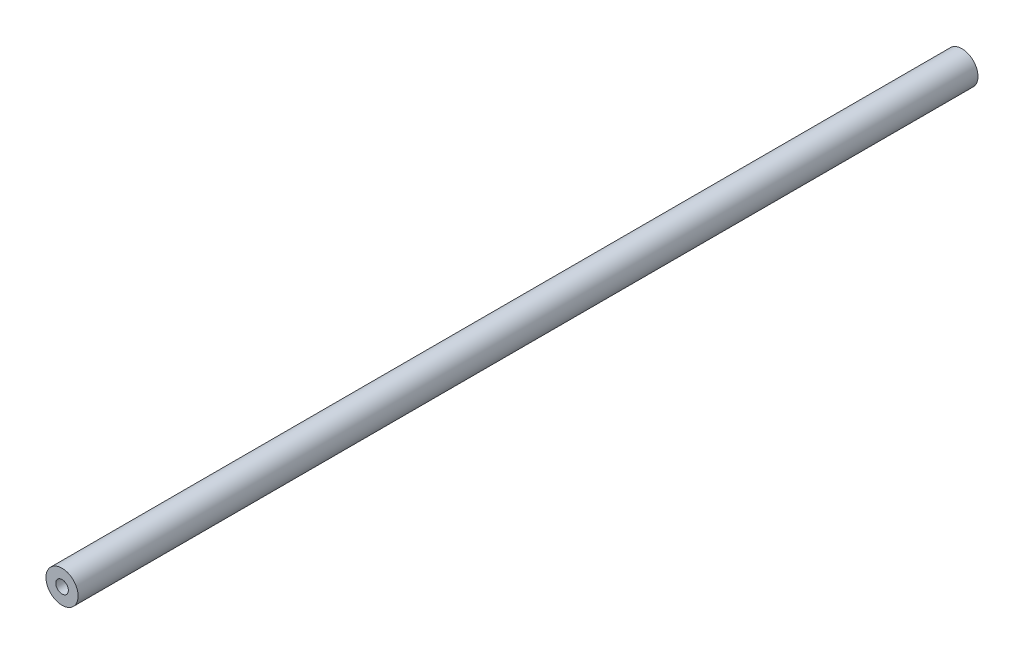
ISO-10303-21;
HEADER;
FILE_DESCRIPTION(('STEP AP214'),'2;1');
FILE_NAME('part.step','',(''),(''),'','','');
FILE_SCHEMA(('AUTOMOTIVE_DESIGN { 1 0 10303 214 1 1 1 1 }'));
ENDSEC;
DATA;
#1=APPLICATION_CONTEXT('core data for automotive mechanical design processes');
#2=APPLICATION_PROTOCOL_DEFINITION('international standard','automotive_design',2000,#1);
#3=PRODUCT_CONTEXT('',#1,'mechanical');
#4=PRODUCT('Part','Part','',(#3));
#5=PRODUCT_RELATED_PRODUCT_CATEGORY('part','',(#4));
#6=PRODUCT_DEFINITION_FORMATION('','',#4);
#7=PRODUCT_DEFINITION_CONTEXT('part definition',#1,'design');
#8=PRODUCT_DEFINITION('design','',#6,#7);
#9=PRODUCT_DEFINITION_SHAPE('','',#8);
#10=(LENGTH_UNIT() NAMED_UNIT(*) SI_UNIT(.MILLI.,.METRE.));
#11=(NAMED_UNIT(*) PLANE_ANGLE_UNIT() SI_UNIT($,.RADIAN.));
#12=(NAMED_UNIT(*) SI_UNIT($,.STERADIAN.) SOLID_ANGLE_UNIT());
#13=UNCERTAINTY_MEASURE_WITH_UNIT(LENGTH_MEASURE(1.E-05),#10,'distance_accuracy_value','');
#14=(GEOMETRIC_REPRESENTATION_CONTEXT(3) GLOBAL_UNCERTAINTY_ASSIGNED_CONTEXT((#13)) GLOBAL_UNIT_ASSIGNED_CONTEXT((#10,
#11,#12)) REPRESENTATION_CONTEXT('',''));
#15=CARTESIAN_POINT('',(0.,0.,0.));
#16=DIRECTION('',(0.,0.,1.));
#17=DIRECTION('',(1.,0.,0.));
#18=AXIS2_PLACEMENT_3D('',#15,#16,#17);
#19=CARTESIAN_POINT('',(0.,0.,177.8));
#20=DIRECTION('',(0.,0.,-1.));
#21=DIRECTION('',(-1.,0.,0.));
#22=AXIS2_PLACEMENT_3D('',#19,#20,#21);
#23=CYLINDRICAL_SURFACE('',#22,6.35);
#24=CARTESIAN_POINT('',(0.,0.,177.8));
#25=DIRECTION('',(0.,0.,1.));
#26=DIRECTION('',(1.,0.,0.));
#27=AXIS2_PLACEMENT_3D('',#24,#25,#26);
#28=CIRCLE('',#27,6.35);
#29=CARTESIAN_POINT('',(6.35,0.,177.8));
#30=VERTEX_POINT('',#29);
#31=EDGE_CURVE('E10',#30,#30,#28,.T.);
#32=ORIENTED_EDGE('',*,*,#31,.F.);
#33=EDGE_LOOP('',(#32));
#34=FACE_BOUND('',#33,.T.);
#35=CARTESIAN_POINT('',(0.,0.,-177.8));
#36=DIRECTION('',(0.,0.,1.));
#37=DIRECTION('',(1.,0.,0.));
#38=AXIS2_PLACEMENT_3D('',#35,#36,#37);
#39=CIRCLE('',#38,6.35);
#40=CARTESIAN_POINT('',(6.35,0.,-177.8));
#41=VERTEX_POINT('',#40);
#42=EDGE_CURVE('E46',#41,#41,#39,.T.);
#43=ORIENTED_EDGE('',*,*,#42,.T.);
#44=EDGE_LOOP('',(#43));
#45=FACE_BOUND('',#44,.T.);
#46=ADVANCED_FACE('F43',(#34,#45),#23,.T.);
#47=CARTESIAN_POINT('',(0.,0.,177.8));
#48=DIRECTION('',(0.,0.,1.));
#49=DIRECTION('',(1.,0.,0.));
#50=AXIS2_PLACEMENT_3D('',#47,#48,#49);
#51=PLANE('',#50);
#52=CARTESIAN_POINT('',(0.,0.,177.8));
#53=DIRECTION('',(0.,0.,1.));
#54=DIRECTION('',(1.,0.,0.));
#55=AXIS2_PLACEMENT_3D('',#52,#53,#54);
#56=CIRCLE('',#55,2.4892);
#57=CARTESIAN_POINT('',(2.4892,0.,177.8));
#58=VERTEX_POINT('',#57);
#59=EDGE_CURVE('E57',#58,#58,#56,.T.);
#60=ORIENTED_EDGE('',*,*,#59,.F.);
#61=EDGE_LOOP('',(#60));
#62=FACE_BOUND('',#61,.T.);
#63=ORIENTED_EDGE('',*,*,#31,.T.);
#64=EDGE_LOOP('',(#63));
#65=FACE_BOUND('',#64,.T.);
#66=ADVANCED_FACE('F85',(#62,#65),#51,.T.);
#67=CARTESIAN_POINT('',(0.,0.,-177.8));
#68=DIRECTION('',(0.,0.,1.));
#69=DIRECTION('',(1.,0.,0.));
#70=AXIS2_PLACEMENT_3D('',#67,#68,#69);
#71=PLANE('',#70);
#72=CARTESIAN_POINT('',(0.,0.,-177.8));
#73=DIRECTION('',(0.,0.,1.));
#74=DIRECTION('',(1.,0.,0.));
#75=AXIS2_PLACEMENT_3D('',#72,#73,#74);
#76=CIRCLE('',#75,2.4892);
#77=CARTESIAN_POINT('',(-2.4892,0.,-177.8));
#78=VERTEX_POINT('',#77);
#79=EDGE_CURVE('E65',#78,#78,#76,.T.);
#80=ORIENTED_EDGE('',*,*,#79,.T.);
#81=EDGE_LOOP('',(#80));
#82=FACE_BOUND('',#81,.T.);
#83=ORIENTED_EDGE('',*,*,#42,.F.);
#84=EDGE_LOOP('',(#83));
#85=FACE_BOUND('',#84,.T.);
#86=ADVANCED_FACE('F90',(#82,#85),#71,.F.);
#87=CARTESIAN_POINT('',(0.,0.,158.75));
#88=DIRECTION('',(0.,0.,1.));
#89=DIRECTION('',(1.,0.,0.));
#90=AXIS2_PLACEMENT_3D('',#87,#88,#89);
#91=CYLINDRICAL_SURFACE('',#90,2.4892);
#92=CARTESIAN_POINT('',(0.,0.,158.75));
#93=DIRECTION('',(0.,0.,1.));
#94=DIRECTION('',(1.,0.,0.));
#95=AXIS2_PLACEMENT_3D('',#92,#93,#94);
#96=CIRCLE('',#95,2.4892);
#97=CARTESIAN_POINT('',(2.4892,0.,158.75));
#98=VERTEX_POINT('',#97);
#99=EDGE_CURVE('E55',#98,#98,#96,.T.);
#100=CARTESIAN_POINT('',(2.4892,0.,158.75));
#101=CARTESIAN_POINT('',(2.4892,0.,158.9484375));
#102=CARTESIAN_POINT('',(2.4892,0.,159.146875));
#103=CARTESIAN_POINT('',(2.4892,0.,159.54375));
#104=CARTESIAN_POINT('',(2.4892,0.,159.7421875));
#105=CARTESIAN_POINT('',(2.4892,0.,160.1390625));
#106=CARTESIAN_POINT('',(2.4892,0.,160.3375));
#107=CARTESIAN_POINT('',(2.4892,0.,160.734375));
#108=CARTESIAN_POINT('',(2.4892,0.,160.9328125));
#109=CARTESIAN_POINT('',(2.4892,0.,161.3296875));
#110=CARTESIAN_POINT('',(2.4892,0.,161.528125));
#111=CARTESIAN_POINT('',(2.4892,0.,161.925));
#112=CARTESIAN_POINT('',(2.4892,0.,162.1234375));
#113=CARTESIAN_POINT('',(2.4892,0.,162.5203125));
#114=CARTESIAN_POINT('',(2.4892,0.,162.71875));
#115=CARTESIAN_POINT('',(2.4892,0.,163.115625));
#116=CARTESIAN_POINT('',(2.4892,0.,163.3140625));
#117=CARTESIAN_POINT('',(2.4892,0.,163.7109375));
#118=CARTESIAN_POINT('',(2.4892,0.,163.909375));
#119=CARTESIAN_POINT('',(2.4892,0.,164.30625));
#120=CARTESIAN_POINT('',(2.4892,0.,164.5046875));
#121=CARTESIAN_POINT('',(2.4892,0.,164.9015625));
#122=CARTESIAN_POINT('',(2.4892,0.,165.1));
#123=CARTESIAN_POINT('',(2.4892,0.,165.496875));
#124=CARTESIAN_POINT('',(2.4892,0.,165.6953125));
#125=CARTESIAN_POINT('',(2.4892,0.,166.0921875));
#126=CARTESIAN_POINT('',(2.4892,0.,166.290625));
#127=CARTESIAN_POINT('',(2.4892,0.,166.6875));
#128=CARTESIAN_POINT('',(2.4892,0.,166.8859375));
#129=CARTESIAN_POINT('',(2.4892,0.,167.2828125));
#130=CARTESIAN_POINT('',(2.4892,0.,167.48125));
#131=CARTESIAN_POINT('',(2.4892,0.,167.878125));
#132=CARTESIAN_POINT('',(2.4892,0.,168.0765625));
#133=CARTESIAN_POINT('',(2.4892,0.,168.4734375));
#134=CARTESIAN_POINT('',(2.4892,0.,168.671875));
#135=CARTESIAN_POINT('',(2.4892,0.,169.06875));
#136=CARTESIAN_POINT('',(2.4892,0.,169.2671875));
#137=CARTESIAN_POINT('',(2.4892,0.,169.6640625));
#138=CARTESIAN_POINT('',(2.4892,0.,169.8625));
#139=CARTESIAN_POINT('',(2.4892,0.,170.259375));
#140=CARTESIAN_POINT('',(2.4892,0.,170.4578125));
#141=CARTESIAN_POINT('',(2.4892,0.,170.8546875));
#142=CARTESIAN_POINT('',(2.4892,0.,171.053125));
#143=CARTESIAN_POINT('',(2.4892,0.,171.45));
#144=CARTESIAN_POINT('',(2.4892,0.,171.6484375));
#145=CARTESIAN_POINT('',(2.4892,0.,172.0453125));
#146=CARTESIAN_POINT('',(2.4892,0.,172.24375));
#147=CARTESIAN_POINT('',(2.4892,0.,172.640625));
#148=CARTESIAN_POINT('',(2.4892,0.,172.8390625));
#149=CARTESIAN_POINT('',(2.4892,0.,173.2359375));
#150=CARTESIAN_POINT('',(2.4892,0.,173.434375));
#151=CARTESIAN_POINT('',(2.4892,0.,173.83125));
#152=CARTESIAN_POINT('',(2.4892,0.,174.0296875));
#153=CARTESIAN_POINT('',(2.4892,0.,174.4265625));
#154=CARTESIAN_POINT('',(2.4892,0.,174.625));
#155=CARTESIAN_POINT('',(2.4892,0.,175.021875));
#156=CARTESIAN_POINT('',(2.4892,0.,175.2203125));
#157=CARTESIAN_POINT('',(2.4892,0.,175.6171875));
#158=CARTESIAN_POINT('',(2.4892,0.,175.815625));
#159=CARTESIAN_POINT('',(2.4892,0.,176.2125));
#160=CARTESIAN_POINT('',(2.4892,0.,176.4109375));
#161=CARTESIAN_POINT('',(2.4892,0.,176.8078125));
#162=CARTESIAN_POINT('',(2.4892,0.,177.00625));
#163=CARTESIAN_POINT('',(2.4892,0.,177.403125));
#164=CARTESIAN_POINT('',(2.4892,0.,177.6015625));
#165=CARTESIAN_POINT('',(2.4892,0.,177.8));
#166=B_SPLINE_CURVE_WITH_KNOTS('',3,(#100,#101,#102,#103,#104,#105,#106,#107,#108,#109,#110,
#111,#112,#113,#114,#115,#116,#117,#118,#119,#120,#121,#122,#123,#124,#125,#126,#127,#128,#129,
#130,#131,#132,#133,#134,#135,#136,#137,#138,#139,#140,#141,#142,#143,#144,#145,#146,#147,#148,
#149,#150,#151,#152,#153,#154,#155,#156,#157,#158,#159,#160,#161,#162,#163,#164,#165),
.UNSPECIFIED.,.F.,.F.,(4,2,2,2,2,2,2,2,2,2,2,2,2,2,2,2,2,2,2,2,2,2,2,2,2,2,2,2,2,2,2,2,4),(0.,
0.5953125,1.190625,1.7859375,2.38125,2.9765625,3.571875,4.1671875,4.7625,5.3578125,5.953125,
6.5484375,7.14375,7.7390625,8.334375,8.92968750000001,9.52500000000001,10.1203125,10.715625,
11.3109375,11.90625,12.5015625,13.096875,13.6921875,14.2875,14.8828125,15.478125,16.0734375,
16.66875,17.2640625,17.859375,18.4546875,19.05),.UNSPECIFIED.);
#167=EDGE_CURVE('BSEAM97',#98,#58,#166,.T.);
#168=ORIENTED_EDGE('',*,*,#99,.F.);
#169=ORIENTED_EDGE('',*,*,#59,.T.);
#170=ORIENTED_EDGE('',*,*,#167,.T.);
#171=ORIENTED_EDGE('',*,*,#167,.F.);
#172=EDGE_LOOP('',(#168,#170,#169,#171));
#173=FACE_BOUND('',#172,.T.);
#174=ADVANCED_FACE('F97',(#173),#91,.F.);
#175=CARTESIAN_POINT('',(0.,0.,158.75));
#176=DIRECTION('',(0.,0.,1.));
#177=DIRECTION('',(1.,0.,0.));
#178=AXIS2_PLACEMENT_3D('',#175,#176,#177);
#179=PLANE('',#178);
#180=ORIENTED_EDGE('',*,*,#99,.T.);
#181=EDGE_LOOP('',(#180));
#182=FACE_BOUND('',#181,.T.);
#183=ADVANCED_FACE('F82',(#182),#179,.T.);
#184=CARTESIAN_POINT('',(0.,0.,-158.75));
#185=DIRECTION('',(0.,0.,-1.));
#186=DIRECTION('',(-1.,0.,0.));
#187=AXIS2_PLACEMENT_3D('',#184,#185,#186);
#188=CYLINDRICAL_SURFACE('',#187,2.4892);
#189=CARTESIAN_POINT('',(0.,0.,-158.75));
#190=DIRECTION('',(0.,0.,1.));
#191=DIRECTION('',(1.,0.,0.));
#192=AXIS2_PLACEMENT_3D('',#189,#190,#191);
#193=CIRCLE('',#192,2.4892);
#194=CARTESIAN_POINT('',(-2.4892,0.,-158.75));
#195=VERTEX_POINT('',#194);
#196=EDGE_CURVE('E61',#195,#195,#193,.T.);
#197=CARTESIAN_POINT('',(-2.4892,0.,-158.75));
#198=CARTESIAN_POINT('',(-2.4892,0.,-158.9484375));
#199=CARTESIAN_POINT('',(-2.4892,0.,-159.146875));
#200=CARTESIAN_POINT('',(-2.4892,0.,-159.54375));
#201=CARTESIAN_POINT('',(-2.4892,0.,-159.7421875));
#202=CARTESIAN_POINT('',(-2.4892,0.,-160.1390625));
#203=CARTESIAN_POINT('',(-2.4892,0.,-160.3375));
#204=CARTESIAN_POINT('',(-2.4892,0.,-160.734375));
#205=CARTESIAN_POINT('',(-2.4892,0.,-160.9328125));
#206=CARTESIAN_POINT('',(-2.4892,0.,-161.3296875));
#207=CARTESIAN_POINT('',(-2.4892,0.,-161.528125));
#208=CARTESIAN_POINT('',(-2.4892,0.,-161.925));
#209=CARTESIAN_POINT('',(-2.4892,0.,-162.1234375));
#210=CARTESIAN_POINT('',(-2.4892,0.,-162.5203125));
#211=CARTESIAN_POINT('',(-2.4892,0.,-162.71875));
#212=CARTESIAN_POINT('',(-2.4892,0.,-163.115625));
#213=CARTESIAN_POINT('',(-2.4892,0.,-163.3140625));
#214=CARTESIAN_POINT('',(-2.4892,0.,-163.7109375));
#215=CARTESIAN_POINT('',(-2.4892,0.,-163.909375));
#216=CARTESIAN_POINT('',(-2.4892,0.,-164.30625));
#217=CARTESIAN_POINT('',(-2.4892,0.,-164.5046875));
#218=CARTESIAN_POINT('',(-2.4892,0.,-164.9015625));
#219=CARTESIAN_POINT('',(-2.4892,0.,-165.1));
#220=CARTESIAN_POINT('',(-2.4892,0.,-165.496875));
#221=CARTESIAN_POINT('',(-2.4892,0.,-165.6953125));
#222=CARTESIAN_POINT('',(-2.4892,0.,-166.0921875));
#223=CARTESIAN_POINT('',(-2.4892,0.,-166.290625));
#224=CARTESIAN_POINT('',(-2.4892,0.,-166.6875));
#225=CARTESIAN_POINT('',(-2.4892,0.,-166.8859375));
#226=CARTESIAN_POINT('',(-2.4892,0.,-167.2828125));
#227=CARTESIAN_POINT('',(-2.4892,0.,-167.48125));
#228=CARTESIAN_POINT('',(-2.4892,0.,-167.878125));
#229=CARTESIAN_POINT('',(-2.4892,0.,-168.0765625));
#230=CARTESIAN_POINT('',(-2.4892,0.,-168.4734375));
#231=CARTESIAN_POINT('',(-2.4892,0.,-168.671875));
#232=CARTESIAN_POINT('',(-2.4892,0.,-169.06875));
#233=CARTESIAN_POINT('',(-2.4892,0.,-169.2671875));
#234=CARTESIAN_POINT('',(-2.4892,0.,-169.6640625));
#235=CARTESIAN_POINT('',(-2.4892,0.,-169.8625));
#236=CARTESIAN_POINT('',(-2.4892,0.,-170.259375));
#237=CARTESIAN_POINT('',(-2.4892,0.,-170.4578125));
#238=CARTESIAN_POINT('',(-2.4892,0.,-170.8546875));
#239=CARTESIAN_POINT('',(-2.4892,0.,-171.053125));
#240=CARTESIAN_POINT('',(-2.4892,0.,-171.45));
#241=CARTESIAN_POINT('',(-2.4892,0.,-171.6484375));
#242=CARTESIAN_POINT('',(-2.4892,0.,-172.0453125));
#243=CARTESIAN_POINT('',(-2.4892,0.,-172.24375));
#244=CARTESIAN_POINT('',(-2.4892,0.,-172.640625));
#245=CARTESIAN_POINT('',(-2.4892,0.,-172.8390625));
#246=CARTESIAN_POINT('',(-2.4892,0.,-173.2359375));
#247=CARTESIAN_POINT('',(-2.4892,0.,-173.434375));
#248=CARTESIAN_POINT('',(-2.4892,0.,-173.83125));
#249=CARTESIAN_POINT('',(-2.4892,0.,-174.0296875));
#250=CARTESIAN_POINT('',(-2.4892,0.,-174.4265625));
#251=CARTESIAN_POINT('',(-2.4892,0.,-174.625));
#252=CARTESIAN_POINT('',(-2.4892,0.,-175.021875));
#253=CARTESIAN_POINT('',(-2.4892,0.,-175.2203125));
#254=CARTESIAN_POINT('',(-2.4892,0.,-175.6171875));
#255=CARTESIAN_POINT('',(-2.4892,0.,-175.815625));
#256=CARTESIAN_POINT('',(-2.4892,0.,-176.2125));
#257=CARTESIAN_POINT('',(-2.4892,0.,-176.4109375));
#258=CARTESIAN_POINT('',(-2.4892,0.,-176.8078125));
#259=CARTESIAN_POINT('',(-2.4892,0.,-177.00625));
#260=CARTESIAN_POINT('',(-2.4892,0.,-177.403125));
#261=CARTESIAN_POINT('',(-2.4892,0.,-177.6015625));
#262=CARTESIAN_POINT('',(-2.4892,0.,-177.8));
#263=B_SPLINE_CURVE_WITH_KNOTS('',3,(#197,#198,#199,#200,#201,#202,#203,#204,#205,#206,#207,
#208,#209,#210,#211,#212,#213,#214,#215,#216,#217,#218,#219,#220,#221,#222,#223,#224,#225,#226,
#227,#228,#229,#230,#231,#232,#233,#234,#235,#236,#237,#238,#239,#240,#241,#242,#243,#244,#245,
#246,#247,#248,#249,#250,#251,#252,#253,#254,#255,#256,#257,#258,#259,#260,#261,#262),
.UNSPECIFIED.,.F.,.F.,(4,2,2,2,2,2,2,2,2,2,2,2,2,2,2,2,2,2,2,2,2,2,2,2,2,2,2,2,2,2,2,2,4),(0.,
0.5953125,1.190625,1.7859375,2.38125,2.9765625,3.571875,4.1671875,4.7625,5.3578125,5.953125,
6.5484375,7.14375,7.7390625,8.334375,8.92968750000001,9.52500000000001,10.1203125,10.715625,
11.3109375,11.90625,12.5015625,13.096875,13.6921875,14.2875,14.8828125,15.478125,16.0734375,
16.66875,17.2640625,17.859375,18.4546875,19.05),.UNSPECIFIED.);
#264=EDGE_CURVE('BSEAM73',#195,#78,#263,.T.);
#265=ORIENTED_EDGE('',*,*,#196,.T.);
#266=ORIENTED_EDGE('',*,*,#79,.F.);
#267=ORIENTED_EDGE('',*,*,#264,.T.);
#268=ORIENTED_EDGE('',*,*,#264,.F.);
#269=EDGE_LOOP('',(#265,#267,#266,#268));
#270=FACE_BOUND('',#269,.T.);
#271=ADVANCED_FACE('F73',(#270),#188,.F.);
#272=CARTESIAN_POINT('',(0.,0.,-158.75));
#273=DIRECTION('',(0.,0.,-1.));
#274=DIRECTION('',(1.,0.,0.));
#275=AXIS2_PLACEMENT_3D('',#272,#273,#274);
#276=PLANE('',#275);
#277=ORIENTED_EDGE('',*,*,#196,.F.);
#278=EDGE_LOOP('',(#277));
#279=FACE_BOUND('',#278,.T.);
#280=ADVANCED_FACE('F76',(#279),#276,.T.);
#281=CLOSED_SHELL('',(#46,#66,#86,#174,#183,#271,#280));
#282=MANIFOLD_SOLID_BREP('B2',#281);
#283=ADVANCED_BREP_SHAPE_REPRESENTATION('',(#18,#282),#14);
#284=SHAPE_DEFINITION_REPRESENTATION(#9,#283);
ENDSEC;
END-ISO-10303-21;
